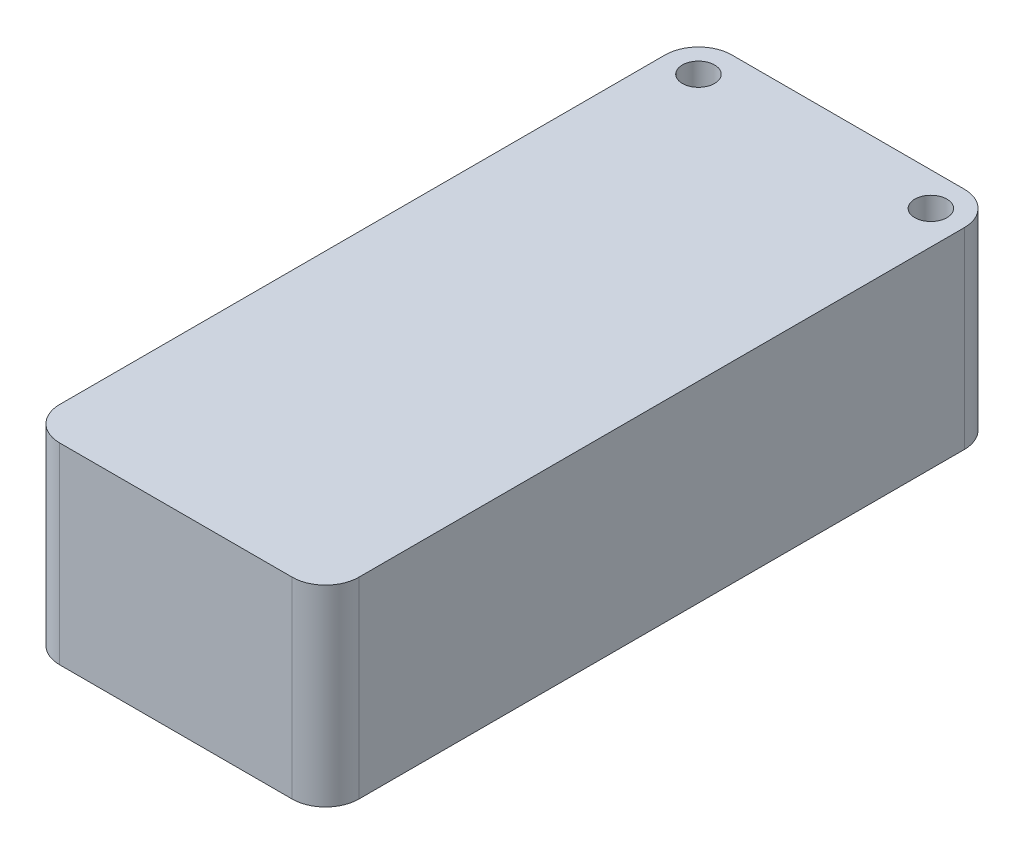
ISO-10303-21;
HEADER;
FILE_DESCRIPTION(('STEP AP214'),'2;1');
FILE_NAME('part.step','',(''),(''),'','','');
FILE_SCHEMA(('AUTOMOTIVE_DESIGN { 1 0 10303 214 1 1 1 1 }'));
ENDSEC;
DATA;
#1=APPLICATION_CONTEXT('core data for automotive mechanical design processes');
#2=APPLICATION_PROTOCOL_DEFINITION('international standard','automotive_design',2000,#1);
#3=PRODUCT_CONTEXT('',#1,'mechanical');
#4=PRODUCT('Part','Part','',(#3));
#5=PRODUCT_RELATED_PRODUCT_CATEGORY('part','',(#4));
#6=PRODUCT_DEFINITION_FORMATION('','',#4);
#7=PRODUCT_DEFINITION_CONTEXT('part definition',#1,'design');
#8=PRODUCT_DEFINITION('design','',#6,#7);
#9=PRODUCT_DEFINITION_SHAPE('','',#8);
#10=(LENGTH_UNIT() NAMED_UNIT(*) SI_UNIT(.MILLI.,.METRE.));
#11=(NAMED_UNIT(*) PLANE_ANGLE_UNIT() SI_UNIT($,.RADIAN.));
#12=(NAMED_UNIT(*) SI_UNIT($,.STERADIAN.) SOLID_ANGLE_UNIT());
#13=UNCERTAINTY_MEASURE_WITH_UNIT(LENGTH_MEASURE(1.E-05),#10,'distance_accuracy_value','');
#14=(GEOMETRIC_REPRESENTATION_CONTEXT(3) GLOBAL_UNCERTAINTY_ASSIGNED_CONTEXT((#13)) GLOBAL_UNIT_ASSIGNED_CONTEXT((#10,
#11,#12)) REPRESENTATION_CONTEXT('',''));
#15=CARTESIAN_POINT('',(0.,0.,0.));
#16=DIRECTION('',(0.,0.,1.));
#17=DIRECTION('',(1.,0.,0.));
#18=AXIS2_PLACEMENT_3D('',#15,#16,#17);
#19=CARTESIAN_POINT('',(0.,14.62,0.));
#20=DIRECTION('',(0.,0.,1.));
#21=DIRECTION('',(1.,0.,0.));
#22=AXIS2_PLACEMENT_3D('',#19,#20,#21);
#23=PLANE('',#22);
#24=DIRECTION('',(-1.,0.,0.));
#25=VECTOR('',#24,1.);
#26=CARTESIAN_POINT('',(0.,0.,0.));
#27=LINE('',#26,#25);
#28=CARTESIAN_POINT('',(20.22,0.,0.));
#29=VERTEX_POINT('',#28);
#30=CARTESIAN_POINT('',(2.54,0.,0.));
#31=VERTEX_POINT('',#30);
#32=EDGE_CURVE('E170',#29,#31,#27,.T.);
#33=ORIENTED_EDGE('',*,*,#32,.T.);
#34=DIRECTION('',(0.,-1.,0.));
#35=VECTOR('',#34,1.);
#36=CARTESIAN_POINT('',(2.54,14.62,0.));
#37=LINE('',#36,#35);
#38=CARTESIAN_POINT('',(2.54,14.62,0.));
#39=VERTEX_POINT('',#38);
#40=EDGE_CURVE('E11',#31,#39,#37,.F.);
#41=ORIENTED_EDGE('',*,*,#40,.T.);
#42=DIRECTION('',(-1.,0.,0.));
#43=VECTOR('',#42,1.);
#44=CARTESIAN_POINT('',(0.,14.62,0.));
#45=LINE('',#44,#43);
#46=CARTESIAN_POINT('',(20.22,14.62,0.));
#47=VERTEX_POINT('',#46);
#48=EDGE_CURVE('E176',#47,#39,#45,.T.);
#49=ORIENTED_EDGE('',*,*,#48,.F.);
#50=DIRECTION('',(0.,-1.,0.));
#51=VECTOR('',#50,1.);
#52=CARTESIAN_POINT('',(20.22,14.62,0.));
#53=LINE('',#52,#51);
#54=EDGE_CURVE('E47',#47,#29,#53,.T.);
#55=ORIENTED_EDGE('',*,*,#54,.T.);
#56=EDGE_LOOP('',(#33,#41,#49,#55));
#57=FACE_BOUND('',#56,.T.);
#58=DIRECTION('',(0.,-1.,0.));
#59=VECTOR('',#58,1.);
#60=CARTESIAN_POINT('',(15.88,11.79,0.));
#61=LINE('',#60,#59);
#62=CARTESIAN_POINT('',(15.88,11.79,0.));
#63=VERTEX_POINT('',#62);
#64=CARTESIAN_POINT('',(15.88,8.59,0.));
#65=VERTEX_POINT('',#64);
#66=EDGE_CURVE('E147',#63,#65,#61,.T.);
#67=ORIENTED_EDGE('',*,*,#66,.F.);
#68=DIRECTION('',(1.,0.,0.));
#69=VECTOR('',#68,1.);
#70=CARTESIAN_POINT('',(15.88,11.79,0.));
#71=LINE('',#70,#69);
#72=CARTESIAN_POINT('',(6.88,11.79,0.));
#73=VERTEX_POINT('',#72);
#74=EDGE_CURVE('E144',#73,#63,#71,.T.);
#75=ORIENTED_EDGE('',*,*,#74,.F.);
#76=DIRECTION('',(0.,1.,0.));
#77=VECTOR('',#76,1.);
#78=CARTESIAN_POINT('',(6.88,11.79,0.));
#79=LINE('',#78,#77);
#80=CARTESIAN_POINT('',(6.88,8.59,0.));
#81=VERTEX_POINT('',#80);
#82=EDGE_CURVE('E59',#81,#73,#79,.T.);
#83=ORIENTED_EDGE('',*,*,#82,.F.);
#84=DIRECTION('',(-1.,0.,0.));
#85=VECTOR('',#84,1.);
#86=CARTESIAN_POINT('',(15.88,8.59,0.));
#87=LINE('',#86,#85);
#88=EDGE_CURVE('E54',#65,#81,#87,.T.);
#89=ORIENTED_EDGE('',*,*,#88,.F.);
#90=EDGE_LOOP('',(#67,#75,#83,#89));
#91=FACE_BOUND('',#90,.T.);
#92=ADVANCED_FACE('F39',(#57,#91),#23,.F.);
#93=CARTESIAN_POINT('',(0.,14.62,0.));
#94=DIRECTION('',(1.,0.,0.));
#95=DIRECTION('',(0.,0.,-1.));
#96=AXIS2_PLACEMENT_3D('',#93,#94,#95);
#97=PLANE('',#96);
#98=DIRECTION('',(0.,0.,1.));
#99=VECTOR('',#98,1.);
#100=CARTESIAN_POINT('',(0.,0.,0.));
#101=LINE('',#100,#99);
#102=CARTESIAN_POINT('',(0.,0.,2.54));
#103=VERTEX_POINT('',#102);
#104=CARTESIAN_POINT('',(0.,0.,48.59));
#105=VERTEX_POINT('',#104);
#106=EDGE_CURVE('E165',#103,#105,#101,.T.);
#107=ORIENTED_EDGE('',*,*,#106,.T.);
#108=DIRECTION('',(0.,-1.,0.));
#109=VECTOR('',#108,1.);
#110=CARTESIAN_POINT('',(0.,14.62,48.59));
#111=LINE('',#110,#109);
#112=CARTESIAN_POINT('',(0.,14.62,48.59));
#113=VERTEX_POINT('',#112);
#114=EDGE_CURVE('E218',#105,#113,#111,.F.);
#115=ORIENTED_EDGE('',*,*,#114,.T.);
#116=DIRECTION('',(0.,0.,1.));
#117=VECTOR('',#116,1.);
#118=CARTESIAN_POINT('',(0.,14.62,0.));
#119=LINE('',#118,#117);
#120=CARTESIAN_POINT('',(0.,14.62,2.54));
#121=VERTEX_POINT('',#120);
#122=EDGE_CURVE('E166',#121,#113,#119,.T.);
#123=ORIENTED_EDGE('',*,*,#122,.F.);
#124=DIRECTION('',(0.,-1.,0.));
#125=VECTOR('',#124,1.);
#126=CARTESIAN_POINT('',(0.,14.62,2.54));
#127=LINE('',#126,#125);
#128=EDGE_CURVE('E215',#121,#103,#127,.T.);
#129=ORIENTED_EDGE('',*,*,#128,.T.);
#130=EDGE_LOOP('',(#107,#115,#123,#129));
#131=FACE_BOUND('',#130,.T.);
#132=ADVANCED_FACE('F237',(#131),#97,.F.);
#133=CARTESIAN_POINT('',(0.,14.62,51.13));
#134=DIRECTION('',(0.,0.,-1.));
#135=DIRECTION('',(-1.,0.,0.));
#136=AXIS2_PLACEMENT_3D('',#133,#134,#135);
#137=PLANE('',#136);
#138=DIRECTION('',(1.,0.,0.));
#139=VECTOR('',#138,1.);
#140=CARTESIAN_POINT('',(0.,0.,51.13));
#141=LINE('',#140,#139);
#142=CARTESIAN_POINT('',(2.54,0.,51.13));
#143=VERTEX_POINT('',#142);
#144=CARTESIAN_POINT('',(20.22,0.,51.13));
#145=VERTEX_POINT('',#144);
#146=EDGE_CURVE('E182',#143,#145,#141,.T.);
#147=ORIENTED_EDGE('',*,*,#146,.T.);
#148=DIRECTION('',(0.,-1.,0.));
#149=VECTOR('',#148,1.);
#150=CARTESIAN_POINT('',(20.22,14.62,51.13));
#151=LINE('',#150,#149);
#152=CARTESIAN_POINT('',(20.22,14.62,51.13));
#153=VERTEX_POINT('',#152);
#154=EDGE_CURVE('E205',#145,#153,#151,.F.);
#155=ORIENTED_EDGE('',*,*,#154,.T.);
#156=DIRECTION('',(1.,0.,0.));
#157=VECTOR('',#156,1.);
#158=CARTESIAN_POINT('',(0.,14.62,51.13));
#159=LINE('',#158,#157);
#160=CARTESIAN_POINT('',(2.54,14.62,51.13));
#161=VERTEX_POINT('',#160);
#162=EDGE_CURVE('E169',#161,#153,#159,.T.);
#163=ORIENTED_EDGE('',*,*,#162,.F.);
#164=DIRECTION('',(0.,-1.,0.));
#165=VECTOR('',#164,1.);
#166=CARTESIAN_POINT('',(2.54,14.62,51.13));
#167=LINE('',#166,#165);
#168=EDGE_CURVE('E202',#161,#143,#167,.T.);
#169=ORIENTED_EDGE('',*,*,#168,.T.);
#170=EDGE_LOOP('',(#147,#155,#163,#169));
#171=FACE_BOUND('',#170,.T.);
#172=ADVANCED_FACE('F248',(#171),#137,.F.);
#173=CARTESIAN_POINT('',(22.76,14.62,0.));
#174=DIRECTION('',(-1.,0.,0.));
#175=DIRECTION('',(0.,0.,1.));
#176=AXIS2_PLACEMENT_3D('',#173,#174,#175);
#177=PLANE('',#176);
#178=DIRECTION('',(0.,0.,-1.));
#179=VECTOR('',#178,1.);
#180=CARTESIAN_POINT('',(22.76,14.62,0.));
#181=LINE('',#180,#179);
#182=CARTESIAN_POINT('',(22.76,14.62,48.59));
#183=VERTEX_POINT('',#182);
#184=CARTESIAN_POINT('',(22.76,14.62,2.54));
#185=VERTEX_POINT('',#184);
#186=EDGE_CURVE('E173',#183,#185,#181,.T.);
#187=ORIENTED_EDGE('',*,*,#186,.F.);
#188=DIRECTION('',(0.,-1.,0.));
#189=VECTOR('',#188,1.);
#190=CARTESIAN_POINT('',(22.76,14.62,48.59));
#191=LINE('',#190,#189);
#192=CARTESIAN_POINT('',(22.76,0.,48.59));
#193=VERTEX_POINT('',#192);
#194=EDGE_CURVE('E191',#183,#193,#191,.T.);
#195=ORIENTED_EDGE('',*,*,#194,.T.);
#196=DIRECTION('',(0.,0.,-1.));
#197=VECTOR('',#196,1.);
#198=CARTESIAN_POINT('',(22.76,0.,0.));
#199=LINE('',#198,#197);
#200=CARTESIAN_POINT('',(22.76,0.,2.54));
#201=VERTEX_POINT('',#200);
#202=EDGE_CURVE('E185',#193,#201,#199,.T.);
#203=ORIENTED_EDGE('',*,*,#202,.T.);
#204=DIRECTION('',(0.,-1.,0.));
#205=VECTOR('',#204,1.);
#206=CARTESIAN_POINT('',(22.76,14.62,2.54));
#207=LINE('',#206,#205);
#208=EDGE_CURVE('E179',#201,#185,#207,.F.);
#209=ORIENTED_EDGE('',*,*,#208,.T.);
#210=EDGE_LOOP('',(#187,#195,#203,#209));
#211=FACE_BOUND('',#210,.T.);
#212=ADVANCED_FACE('F256',(#211),#177,.F.);
#213=CARTESIAN_POINT('',(0.,14.62,0.));
#214=DIRECTION('',(0.,1.,0.));
#215=DIRECTION('',(0.,0.,1.));
#216=AXIS2_PLACEMENT_3D('',#213,#214,#215);
#217=PLANE('',#216);
#218=CARTESIAN_POINT('',(2.54,14.62,2.54));
#219=DIRECTION('',(0.,1.,0.));
#220=DIRECTION('',(0.,0.,1.));
#221=AXIS2_PLACEMENT_3D('',#218,#219,#220);
#222=CIRCLE('',#221,1.225);
#223=CARTESIAN_POINT('',(2.54,14.62,3.765));
#224=VERTEX_POINT('',#223);
#225=EDGE_CURVE('E162',#224,#224,#222,.T.);
#226=ORIENTED_EDGE('',*,*,#225,.F.);
#227=EDGE_LOOP('',(#226));
#228=FACE_BOUND('',#227,.T.);
#229=CARTESIAN_POINT('',(20.22,14.62,2.54));
#230=DIRECTION('',(0.,1.,0.));
#231=DIRECTION('',(0.,0.,1.));
#232=AXIS2_PLACEMENT_3D('',#229,#230,#231);
#233=CIRCLE('',#232,1.225);
#234=CARTESIAN_POINT('',(20.22,14.62,3.765));
#235=VERTEX_POINT('',#234);
#236=EDGE_CURVE('E158',#235,#235,#233,.T.);
#237=ORIENTED_EDGE('',*,*,#236,.F.);
#238=EDGE_LOOP('',(#237));
#239=FACE_BOUND('',#238,.T.);
#240=ORIENTED_EDGE('',*,*,#162,.T.);
#241=CARTESIAN_POINT('',(20.22,14.62,48.59));
#242=DIRECTION('',(0.,1.,0.));
#243=DIRECTION('',(0.,0.,1.));
#244=AXIS2_PLACEMENT_3D('',#241,#242,#243);
#245=CIRCLE('',#244,2.54);
#246=EDGE_CURVE('E213',#153,#183,#245,.T.);
#247=ORIENTED_EDGE('',*,*,#246,.T.);
#248=ORIENTED_EDGE('',*,*,#186,.T.);
#249=CARTESIAN_POINT('',(20.22,14.62,2.54));
#250=DIRECTION('',(0.,1.,0.));
#251=DIRECTION('',(0.,0.,1.));
#252=AXIS2_PLACEMENT_3D('',#249,#250,#251);
#253=CIRCLE('',#252,2.54);
#254=EDGE_CURVE('E207',#185,#47,#253,.T.);
#255=ORIENTED_EDGE('',*,*,#254,.T.);
#256=ORIENTED_EDGE('',*,*,#48,.T.);
#257=CARTESIAN_POINT('',(2.54,14.62,2.54));
#258=DIRECTION('',(0.,1.,0.));
#259=DIRECTION('',(0.,0.,1.));
#260=AXIS2_PLACEMENT_3D('',#257,#258,#259);
#261=CIRCLE('',#260,2.54);
#262=EDGE_CURVE('E209',#39,#121,#261,.T.);
#263=ORIENTED_EDGE('',*,*,#262,.T.);
#264=ORIENTED_EDGE('',*,*,#122,.T.);
#265=CARTESIAN_POINT('',(2.54,14.62,48.59));
#266=DIRECTION('',(0.,1.,0.));
#267=DIRECTION('',(0.,0.,1.));
#268=AXIS2_PLACEMENT_3D('',#265,#266,#267);
#269=CIRCLE('',#268,2.54);
#270=EDGE_CURVE('E211',#113,#161,#269,.T.);
#271=ORIENTED_EDGE('',*,*,#270,.T.);
#272=EDGE_LOOP('',(#240,#247,#248,#255,#256,#263,#264,#271));
#273=FACE_BOUND('',#272,.T.);
#274=ADVANCED_FACE('F241',(#228,#239,#273),#217,.T.);
#275=CARTESIAN_POINT('',(0.,0.,0.));
#276=DIRECTION('',(0.,1.,0.));
#277=DIRECTION('',(0.,0.,1.));
#278=AXIS2_PLACEMENT_3D('',#275,#276,#277);
#279=PLANE('',#278);
#280=CARTESIAN_POINT('',(2.54,0.,2.54));
#281=DIRECTION('',(0.,1.,0.));
#282=DIRECTION('',(0.,0.,1.));
#283=AXIS2_PLACEMENT_3D('',#280,#281,#282);
#284=CIRCLE('',#283,1.225);
#285=CARTESIAN_POINT('',(2.54,0.,3.765));
#286=VERTEX_POINT('',#285);
#287=EDGE_CURVE('E151',#286,#286,#284,.T.);
#288=ORIENTED_EDGE('',*,*,#287,.T.);
#289=EDGE_LOOP('',(#288));
#290=FACE_BOUND('',#289,.T.);
#291=CARTESIAN_POINT('',(20.22,0.,2.54));
#292=DIRECTION('',(0.,1.,0.));
#293=DIRECTION('',(0.,0.,1.));
#294=AXIS2_PLACEMENT_3D('',#291,#292,#293);
#295=CIRCLE('',#294,1.225);
#296=CARTESIAN_POINT('',(20.22,0.,3.765));
#297=VERTEX_POINT('',#296);
#298=EDGE_CURVE('E148',#297,#297,#295,.T.);
#299=ORIENTED_EDGE('',*,*,#298,.T.);
#300=EDGE_LOOP('',(#299));
#301=FACE_BOUND('',#300,.T.);
#302=ORIENTED_EDGE('',*,*,#202,.F.);
#303=CARTESIAN_POINT('',(20.22,0.,48.59));
#304=DIRECTION('',(0.,1.,0.));
#305=DIRECTION('',(0.,0.,1.));
#306=AXIS2_PLACEMENT_3D('',#303,#304,#305);
#307=CIRCLE('',#306,2.54);
#308=EDGE_CURVE('E200',#193,#145,#307,.F.);
#309=ORIENTED_EDGE('',*,*,#308,.T.);
#310=ORIENTED_EDGE('',*,*,#146,.F.);
#311=CARTESIAN_POINT('',(2.54,0.,48.59));
#312=DIRECTION('',(0.,1.,0.));
#313=DIRECTION('',(0.,0.,1.));
#314=AXIS2_PLACEMENT_3D('',#311,#312,#313);
#315=CIRCLE('',#314,2.54);
#316=EDGE_CURVE('E198',#143,#105,#315,.F.);
#317=ORIENTED_EDGE('',*,*,#316,.T.);
#318=ORIENTED_EDGE('',*,*,#106,.F.);
#319=CARTESIAN_POINT('',(2.54,0.,2.54));
#320=DIRECTION('',(0.,1.,0.));
#321=DIRECTION('',(0.,0.,1.));
#322=AXIS2_PLACEMENT_3D('',#319,#320,#321);
#323=CIRCLE('',#322,2.54);
#324=EDGE_CURVE('E196',#103,#31,#323,.F.);
#325=ORIENTED_EDGE('',*,*,#324,.T.);
#326=ORIENTED_EDGE('',*,*,#32,.F.);
#327=CARTESIAN_POINT('',(20.22,0.,2.54));
#328=DIRECTION('',(0.,1.,0.));
#329=DIRECTION('',(0.,0.,1.));
#330=AXIS2_PLACEMENT_3D('',#327,#328,#329);
#331=CIRCLE('',#330,2.54);
#332=EDGE_CURVE('E194',#29,#201,#331,.F.);
#333=ORIENTED_EDGE('',*,*,#332,.T.);
#334=EDGE_LOOP('',(#302,#309,#310,#317,#318,#325,#326,#333));
#335=FACE_BOUND('',#334,.T.);
#336=ADVANCED_FACE('F229',(#290,#301,#335),#279,.F.);
#337=CARTESIAN_POINT('',(20.22,0.,2.54));
#338=DIRECTION('',(0.,1.,0.));
#339=DIRECTION('',(0.,0.,1.));
#340=AXIS2_PLACEMENT_3D('',#337,#338,#339);
#341=CYLINDRICAL_SURFACE('',#340,1.225);
#342=ORIENTED_EDGE('',*,*,#236,.T.);
#343=EDGE_LOOP('',(#342));
#344=FACE_BOUND('',#343,.T.);
#345=ORIENTED_EDGE('',*,*,#298,.F.);
#346=EDGE_LOOP('',(#345));
#347=FACE_BOUND('',#346,.T.);
#348=ADVANCED_FACE('F348',(#344,#347),#341,.F.);
#349=CARTESIAN_POINT('',(2.54,0.,2.54));
#350=DIRECTION('',(0.,1.,0.));
#351=DIRECTION('',(0.,0.,1.));
#352=AXIS2_PLACEMENT_3D('',#349,#350,#351);
#353=CYLINDRICAL_SURFACE('',#352,1.225);
#354=ORIENTED_EDGE('',*,*,#225,.T.);
#355=EDGE_LOOP('',(#354));
#356=FACE_BOUND('',#355,.T.);
#357=ORIENTED_EDGE('',*,*,#287,.F.);
#358=EDGE_LOOP('',(#357));
#359=FACE_BOUND('',#358,.T.);
#360=ADVANCED_FACE('F279',(#356,#359),#353,.F.);
#361=CARTESIAN_POINT('',(20.22,14.62,48.59));
#362=DIRECTION('',(0.,-1.,0.));
#363=DIRECTION('',(0.,0.,-1.));
#364=AXIS2_PLACEMENT_3D('',#361,#362,#363);
#365=CYLINDRICAL_SURFACE('',#364,2.54);
#366=ORIENTED_EDGE('',*,*,#246,.F.);
#367=ORIENTED_EDGE('',*,*,#154,.F.);
#368=ORIENTED_EDGE('',*,*,#308,.F.);
#369=ORIENTED_EDGE('',*,*,#194,.F.);
#370=EDGE_LOOP('',(#366,#367,#368,#369));
#371=FACE_BOUND('',#370,.T.);
#372=ADVANCED_FACE('F253',(#371),#365,.T.);
#373=CARTESIAN_POINT('',(2.54,14.62,48.59));
#374=DIRECTION('',(0.,-1.,0.));
#375=DIRECTION('',(0.,0.,-1.));
#376=AXIS2_PLACEMENT_3D('',#373,#374,#375);
#377=CYLINDRICAL_SURFACE('',#376,2.54);
#378=ORIENTED_EDGE('',*,*,#270,.F.);
#379=ORIENTED_EDGE('',*,*,#114,.F.);
#380=ORIENTED_EDGE('',*,*,#316,.F.);
#381=ORIENTED_EDGE('',*,*,#168,.F.);
#382=EDGE_LOOP('',(#378,#379,#380,#381));
#383=FACE_BOUND('',#382,.T.);
#384=ADVANCED_FACE('F245',(#383),#377,.T.);
#385=CARTESIAN_POINT('',(2.54,14.62,2.54));
#386=DIRECTION('',(0.,-1.,0.));
#387=DIRECTION('',(0.,0.,-1.));
#388=AXIS2_PLACEMENT_3D('',#385,#386,#387);
#389=CYLINDRICAL_SURFACE('',#388,2.54);
#390=ORIENTED_EDGE('',*,*,#262,.F.);
#391=ORIENTED_EDGE('',*,*,#40,.F.);
#392=ORIENTED_EDGE('',*,*,#324,.F.);
#393=ORIENTED_EDGE('',*,*,#128,.F.);
#394=EDGE_LOOP('',(#390,#391,#392,#393));
#395=FACE_BOUND('',#394,.T.);
#396=ADVANCED_FACE('F234',(#395),#389,.T.);
#397=CARTESIAN_POINT('',(20.22,14.62,2.54));
#398=DIRECTION('',(0.,-1.,0.));
#399=DIRECTION('',(0.,0.,-1.));
#400=AXIS2_PLACEMENT_3D('',#397,#398,#399);
#401=CYLINDRICAL_SURFACE('',#400,2.54);
#402=ORIENTED_EDGE('',*,*,#254,.F.);
#403=ORIENTED_EDGE('',*,*,#208,.F.);
#404=ORIENTED_EDGE('',*,*,#332,.F.);
#405=ORIENTED_EDGE('',*,*,#54,.F.);
#406=EDGE_LOOP('',(#402,#403,#404,#405));
#407=FACE_BOUND('',#406,.T.);
#408=ADVANCED_FACE('F41',(#407),#401,.T.);
#409=CARTESIAN_POINT('',(15.88,11.79,-1.12));
#410=DIRECTION('',(-1.,0.,0.));
#411=DIRECTION('',(0.,0.,1.));
#412=AXIS2_PLACEMENT_3D('',#409,#410,#411);
#413=PLANE('',#412);
#414=ORIENTED_EDGE('',*,*,#66,.T.);
#415=DIRECTION('',(0.,0.,1.));
#416=VECTOR('',#415,1.);
#417=CARTESIAN_POINT('',(15.88,8.59,-1.12));
#418=LINE('',#417,#416);
#419=CARTESIAN_POINT('',(15.88,8.59,-1.12));
#420=VERTEX_POINT('',#419);
#421=EDGE_CURVE('E128',#420,#65,#418,.T.);
#422=ORIENTED_EDGE('',*,*,#421,.F.);
#423=DIRECTION('',(0.,-1.,0.));
#424=VECTOR('',#423,1.);
#425=CARTESIAN_POINT('',(15.88,11.79,-1.12));
#426=LINE('',#425,#424);
#427=CARTESIAN_POINT('',(15.88,11.79,-1.12));
#428=VERTEX_POINT('',#427);
#429=EDGE_CURVE('E135',#428,#420,#426,.T.);
#430=ORIENTED_EDGE('',*,*,#429,.F.);
#431=DIRECTION('',(0.,0.,1.));
#432=VECTOR('',#431,1.);
#433=CARTESIAN_POINT('',(15.88,11.79,-1.12));
#434=LINE('',#433,#432);
#435=EDGE_CURVE('E412',#428,#63,#434,.T.);
#436=ORIENTED_EDGE('',*,*,#435,.T.);
#437=EDGE_LOOP('',(#414,#422,#430,#436));
#438=FACE_BOUND('',#437,.T.);
#439=ADVANCED_FACE('F146',(#438),#413,.F.);
#440=CARTESIAN_POINT('',(15.88,8.59,-1.12));
#441=DIRECTION('',(0.,1.,0.));
#442=DIRECTION('',(0.,0.,1.));
#443=AXIS2_PLACEMENT_3D('',#440,#441,#442);
#444=PLANE('',#443);
#445=ORIENTED_EDGE('',*,*,#88,.T.);
#446=DIRECTION('',(0.,0.,1.));
#447=VECTOR('',#446,1.);
#448=CARTESIAN_POINT('',(6.88,8.59,-1.12));
#449=LINE('',#448,#447);
#450=CARTESIAN_POINT('',(6.88,8.59,-1.12));
#451=VERTEX_POINT('',#450);
#452=EDGE_CURVE('E131',#451,#81,#449,.T.);
#453=ORIENTED_EDGE('',*,*,#452,.F.);
#454=DIRECTION('',(-1.,0.,0.));
#455=VECTOR('',#454,1.);
#456=CARTESIAN_POINT('',(15.88,8.59,-1.12));
#457=LINE('',#456,#455);
#458=EDGE_CURVE('E124',#420,#451,#457,.T.);
#459=ORIENTED_EDGE('',*,*,#458,.F.);
#460=ORIENTED_EDGE('',*,*,#421,.T.);
#461=EDGE_LOOP('',(#445,#453,#459,#460));
#462=FACE_BOUND('',#461,.T.);
#463=ADVANCED_FACE('F126',(#462),#444,.F.);
#464=CARTESIAN_POINT('',(6.88,11.79,-1.12));
#465=DIRECTION('',(1.,0.,0.));
#466=DIRECTION('',(0.,0.,-1.));
#467=AXIS2_PLACEMENT_3D('',#464,#465,#466);
#468=PLANE('',#467);
#469=ORIENTED_EDGE('',*,*,#82,.T.);
#470=DIRECTION('',(0.,0.,1.));
#471=VECTOR('',#470,1.);
#472=CARTESIAN_POINT('',(6.88,11.79,-1.12));
#473=LINE('',#472,#471);
#474=CARTESIAN_POINT('',(6.88,11.79,-1.12));
#475=VERTEX_POINT('',#474);
#476=EDGE_CURVE('E153',#475,#73,#473,.T.);
#477=ORIENTED_EDGE('',*,*,#476,.F.);
#478=DIRECTION('',(0.,1.,0.));
#479=VECTOR('',#478,1.);
#480=CARTESIAN_POINT('',(6.88,11.79,-1.12));
#481=LINE('',#480,#479);
#482=EDGE_CURVE('E134',#451,#475,#481,.T.);
#483=ORIENTED_EDGE('',*,*,#482,.F.);
#484=ORIENTED_EDGE('',*,*,#452,.T.);
#485=EDGE_LOOP('',(#469,#477,#483,#484));
#486=FACE_BOUND('',#485,.T.);
#487=ADVANCED_FACE('F315',(#486),#468,.F.);
#488=CARTESIAN_POINT('',(15.88,11.79,-1.12));
#489=DIRECTION('',(0.,-1.,0.));
#490=DIRECTION('',(1.,0.,0.));
#491=AXIS2_PLACEMENT_3D('',#488,#489,#490);
#492=PLANE('',#491);
#493=ORIENTED_EDGE('',*,*,#74,.T.);
#494=ORIENTED_EDGE('',*,*,#435,.F.);
#495=DIRECTION('',(1.,0.,0.));
#496=VECTOR('',#495,1.);
#497=CARTESIAN_POINT('',(15.88,11.79,-1.12));
#498=LINE('',#497,#496);
#499=EDGE_CURVE('E140',#475,#428,#498,.T.);
#500=ORIENTED_EDGE('',*,*,#499,.F.);
#501=ORIENTED_EDGE('',*,*,#476,.T.);
#502=EDGE_LOOP('',(#493,#494,#500,#501));
#503=FACE_BOUND('',#502,.T.);
#504=ADVANCED_FACE('F324',(#503),#492,.F.);
#505=CARTESIAN_POINT('',(0.,0.,-1.12));
#506=DIRECTION('',(0.,0.,-1.));
#507=DIRECTION('',(-1.,0.,0.));
#508=AXIS2_PLACEMENT_3D('',#505,#506,#507);
#509=PLANE('',#508);
#510=ORIENTED_EDGE('',*,*,#429,.T.);
#511=ORIENTED_EDGE('',*,*,#458,.T.);
#512=ORIENTED_EDGE('',*,*,#482,.T.);
#513=ORIENTED_EDGE('',*,*,#499,.T.);
#514=EDGE_LOOP('',(#510,#511,#512,#513));
#515=FACE_BOUND('',#514,.T.);
#516=ADVANCED_FACE('F138',(#515),#509,.T.);
#517=CLOSED_SHELL('',(#92,#132,#172,#212,#274,#336,#348,#360,#372,#384,#396,#408,#439,#463,#487,
#504,#516));
#518=MANIFOLD_SOLID_BREP('B2',#517);
#519=ADVANCED_BREP_SHAPE_REPRESENTATION('',(#18,#518),#14);
#520=SHAPE_DEFINITION_REPRESENTATION(#9,#519);
ENDSEC;
END-ISO-10303-21;
